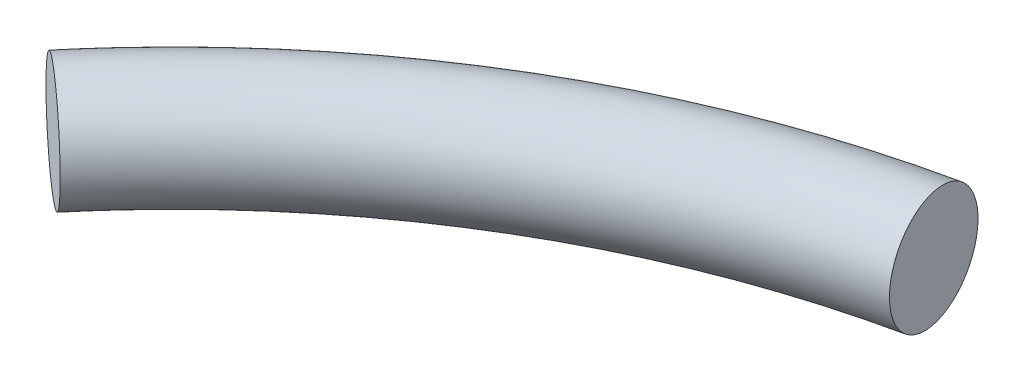
ISO-10303-21;
HEADER;
FILE_DESCRIPTION(('STEP AP214'),'2;1');
FILE_NAME('part.step','',(''),(''),'','','');
FILE_SCHEMA(('AUTOMOTIVE_DESIGN { 1 0 10303 214 1 1 1 1 }'));
ENDSEC;
DATA;
#1=APPLICATION_CONTEXT('core data for automotive mechanical design processes');
#2=APPLICATION_PROTOCOL_DEFINITION('international standard','automotive_design',2000,#1);
#3=PRODUCT_CONTEXT('',#1,'mechanical');
#4=PRODUCT('Part','Part','',(#3));
#5=PRODUCT_RELATED_PRODUCT_CATEGORY('part','',(#4));
#6=PRODUCT_DEFINITION_FORMATION('','',#4);
#7=PRODUCT_DEFINITION_CONTEXT('part definition',#1,'design');
#8=PRODUCT_DEFINITION('design','',#6,#7);
#9=PRODUCT_DEFINITION_SHAPE('','',#8);
#10=(LENGTH_UNIT() NAMED_UNIT(*) SI_UNIT(.MILLI.,.METRE.));
#11=(NAMED_UNIT(*) PLANE_ANGLE_UNIT() SI_UNIT($,.RADIAN.));
#12=(NAMED_UNIT(*) SI_UNIT($,.STERADIAN.) SOLID_ANGLE_UNIT());
#13=UNCERTAINTY_MEASURE_WITH_UNIT(LENGTH_MEASURE(1.E-05),#10,'distance_accuracy_value','');
#14=(GEOMETRIC_REPRESENTATION_CONTEXT(3) GLOBAL_UNCERTAINTY_ASSIGNED_CONTEXT((#13)) GLOBAL_UNIT_ASSIGNED_CONTEXT((#10,
#11,#12)) REPRESENTATION_CONTEXT('',''));
#15=CARTESIAN_POINT('',(0.,0.,0.));
#16=DIRECTION('',(0.,0.,1.));
#17=DIRECTION('',(1.,0.,0.));
#18=AXIS2_PLACEMENT_3D('',#15,#16,#17);
#19=CARTESIAN_POINT('',(0.,0.,0.));
#20=DIRECTION('',(-0.978147600733797,0.,0.207911690817799));
#21=DIRECTION('',(0.207911690817799,0.,0.978147600733797));
#22=AXIS2_PLACEMENT_3D('',#19,#20,#21);
#23=PLANE('',#22);
#24=CARTESIAN_POINT('',(-1.50989125384964,5.2698,-7.10347985489777));
#25=CARTESIAN_POINT('',(-1.50989087011155,5.24734475844036,-7.10347804955197));
#26=CARTESIAN_POINT('',(-1.50949666913671,5.22486914274062,-7.10162347977657));
#27=CARTESIAN_POINT('',(-1.50792840970871,5.1805175487025,-7.09424539925213));
#28=CARTESIAN_POINT('',(-1.50675268218475,5.158642958289,-7.08871403614237));
#29=CARTESIAN_POINT('',(-1.5036563970018,5.11619038165277,-7.07414715964313));
#30=CARTESIAN_POINT('',(-1.50173716873372,5.09561015699665,-7.06511790054617));
#31=CARTESIAN_POINT('',(-1.49720480253545,5.05626266277758,-7.04379479406258));
#32=CARTESIAN_POINT('',(-1.49459068021676,5.03749801701042,-7.03149631549222));
#33=CARTESIAN_POINT('',(-1.48874829778631,5.00237251506183,-7.00401006719887));
#34=CARTESIAN_POINT('',(-1.4855209088445,4.98600830669737,-6.98882639600825));
#35=CARTESIAN_POINT('',(-1.47853615378673,4.9560951150933,-6.95596570705613));
#36=CARTESIAN_POINT('',(-1.47477805207972,4.94255010496093,-6.93828522861083));
#37=CARTESIAN_POINT('',(-1.46684505223587,4.91869805812555,-6.90096339868698));
#38=CARTESIAN_POINT('',(-1.46267045967033,4.9083886701999,-6.88132348480836));
#39=CARTESIAN_POINT('',(-1.45402041998998,4.89128651697562,-6.84062824768));
#40=CARTESIAN_POINT('',(-1.44954495519316,4.88449395856254,-6.81957284124297));
#41=CARTESIAN_POINT('',(-1.44042058428252,4.87461938707083,-6.77664605112673));
#42=CARTESIAN_POINT('',(-1.43577168327323,4.87153726487626,-6.75477469146245));
#43=CARTESIAN_POINT('',(-1.42643228285054,4.8691706838228,-6.7108362670294));
#44=CARTESIAN_POINT('',(-1.42174178343714,4.86988622496393,-6.68876920226063));
#45=CARTESIAN_POINT('',(-1.41245219710747,4.87509474506563,-6.64506513470946));
#46=CARTESIAN_POINT('',(-1.40785311288364,4.87958783511791,-6.62342814459403));
#47=CARTESIAN_POINT('',(-1.39887733290804,4.89222364907398,-6.58120041986478));
#48=CARTESIAN_POINT('',(-1.39450062409193,4.90036615830119,-6.56060962378806));
#49=CARTESIAN_POINT('',(-1.38609045138739,4.92007688548478,-6.52104287205636));
#50=CARTESIAN_POINT('',(-1.38205724001212,4.93164759608104,-6.50206810438239));
#51=CARTESIAN_POINT('',(-1.37445764650861,4.95786514969766,-6.46631482796599));
#52=CARTESIAN_POINT('',(-1.37089061966088,4.97250766984349,-6.44953328605683));
#53=CARTESIAN_POINT('',(-1.3643132027818,5.00448602525169,-6.41858897256494));
#54=CARTESIAN_POINT('',(-1.36130360586346,5.02182563442235,-6.40442993228553));
#55=CARTESIAN_POINT('',(-1.35593671636524,5.05866468164223,-6.37918070235798));
#56=CARTESIAN_POINT('',(-1.35357850216772,5.07816101291839,-6.36808617683968));
#57=CARTESIAN_POINT('',(-1.349571907778,5.11881373737466,-6.34923663223735));
#58=CARTESIAN_POINT('',(-1.34792480071488,5.1399730284603,-6.3414876027547));
#59=CARTESIAN_POINT('',(-1.34539628575177,5.18328650996402,-6.32959187512699));
#60=CARTESIAN_POINT('',(-1.34451324834242,5.20543847660513,-6.32543751074315));
#61=CARTESIAN_POINT('',(-1.34371535132199,5.241730237853,-6.32168370039655));
#62=CARTESIAN_POINT('',(-1.34356166128498,5.25576113714254,-6.32096064562093));
#63=CARTESIAN_POINT('',(-1.3435622849335,5.29225524155964,-6.32096357965653));
#64=CARTESIAN_POINT('',(-1.34395648590833,5.31473085725938,-6.32281814943193));
#65=CARTESIAN_POINT('',(-1.34552474533633,5.35908245129751,-6.33019622995637));
#66=CARTESIAN_POINT('',(-1.3467004728603,5.380957041711,-6.33572759306613));
#67=CARTESIAN_POINT('',(-1.34979675804324,5.42340961834723,-6.35029446956537));
#68=CARTESIAN_POINT('',(-1.35171598631132,5.44398984300335,-6.35932372866233));
#69=CARTESIAN_POINT('',(-1.3562483525096,5.48333733722242,-6.38064683514592));
#70=CARTESIAN_POINT('',(-1.35886247482829,5.50210198298958,-6.39294531371628));
#71=CARTESIAN_POINT('',(-1.36470485725873,5.53722748493817,-6.42043156200963));
#72=CARTESIAN_POINT('',(-1.36793224620054,5.55359169330263,-6.43561523320025));
#73=CARTESIAN_POINT('',(-1.37491700125831,5.5835048849067,-6.46847592215237));
#74=CARTESIAN_POINT('',(-1.37867510296533,5.59704989503907,-6.48615640059767));
#75=CARTESIAN_POINT('',(-1.38660810280918,5.62090194187445,-6.52347823052152));
#76=CARTESIAN_POINT('',(-1.39078269537471,5.6312113298001,-6.54311814440014));
#77=CARTESIAN_POINT('',(-1.39943273505506,5.64831348302438,-6.5838133815285));
#78=CARTESIAN_POINT('',(-1.40390819985188,5.65510604143746,-6.60486878796552));
#79=CARTESIAN_POINT('',(-1.41303257076252,5.66498061292917,-6.64779557808177));
#80=CARTESIAN_POINT('',(-1.41768147177181,5.66806273512374,-6.66966693774605));
#81=CARTESIAN_POINT('',(-1.4270208721945,5.6704293161772,-6.7136053621791));
#82=CARTESIAN_POINT('',(-1.4317113716079,5.66971377503608,-6.73567242694787));
#83=CARTESIAN_POINT('',(-1.44100095793758,5.66450525493437,-6.77937649449904));
#84=CARTESIAN_POINT('',(-1.4456000421614,5.66001216488209,-6.80101348461448));
#85=CARTESIAN_POINT('',(-1.454575822137,5.64737635092602,-6.84324120934372));
#86=CARTESIAN_POINT('',(-1.45895253095312,5.63923384169881,-6.86383200542044));
#87=CARTESIAN_POINT('',(-1.46736270365766,5.61952311451522,-6.90339875715214));
#88=CARTESIAN_POINT('',(-1.47139591503293,5.60795240391896,-6.92237352482611));
#89=CARTESIAN_POINT('',(-1.47899550853644,5.58173485030234,-6.95812680124251));
#90=CARTESIAN_POINT('',(-1.48256253538417,5.56709233015651,-6.97490834315167));
#91=CARTESIAN_POINT('',(-1.48913995226325,5.53511397474831,-7.00585265664356));
#92=CARTESIAN_POINT('',(-1.49214954918158,5.51777436557765,-7.02001169692297));
#93=CARTESIAN_POINT('',(-1.4975164386798,5.48093531835777,-7.04526092685052));
#94=CARTESIAN_POINT('',(-1.49987465287733,5.46143898708161,-7.05635545236882));
#95=CARTESIAN_POINT('',(-1.50388124726705,5.42078626262534,-7.07520499697115));
#96=CARTESIAN_POINT('',(-1.50552835433016,5.3996269715397,-7.0829540264538));
#97=CARTESIAN_POINT('',(-1.50805686929327,5.35631349003598,-7.09484975408151));
#98=CARTESIAN_POINT('',(-1.50893990670263,5.33416152339487,-7.09900411846535));
#99=CARTESIAN_POINT('',(-1.50973780372306,5.29786976214701,-7.10275792881195));
#100=CARTESIAN_POINT('',(-1.50989149376007,5.28383886285746,-7.10348098358757));
#101=CARTESIAN_POINT('',(-1.50989125384964,5.2698,-7.10347985489777));
#102=B_SPLINE_CURVE_WITH_KNOTS('',3,(#24,#25,#26,#27,#28,#29,#30,#31,#32,#33,#34,#35,#36,#37,
#38,#39,#40,#41,#42,#43,#44,#45,#46,#47,#48,#49,#50,#51,#52,#53,#54,#55,#56,#57,#58,#59,#60,#61,
#62,#63,#64,#65,#66,#67,#68,#69,#70,#71,#72,#73,#74,#75,#76,#77,#78,#79,#80,#81,#82,#83,#84,#85,
#86,#87,#88,#89,#90,#91,#92,#93,#94,#95,#96,#97,#98,#99,#100,#101),.UNSPECIFIED.,.T.,.F.,(4,2,2,
2,2,2,2,2,2,2,2,2,2,2,2,2,2,2,2,2,2,2,2,2,2,2,2,2,2,2,2,2,2,2,2,2,2,2,4),(0.,0.067321719094076,
0.134787678055462,0.2021335594909,0.269575356418625,0.336922056232695,0.40436303479347,
0.471754892083668,0.539150713403567,0.606544552708821,0.673938392014077,0.741334213333976,
0.808726070624175,0.876167049184948,0.943513748999018,1.01095554592846,1.07830142736561,
1.14576738632871,1.2130891054245,1.25517818200736,1.32249990110144,1.38996586006282,
1.45731174149826,1.52475353842599,1.59210023824006,1.65954121680083,1.72693307409103,
1.79432889541093,1.86172273471618,1.92911657402144,1.99651239534134,2.06390425263154,
2.13134523119231,2.19869193100638,2.26613372793582,2.33347960937297,2.40094556833608,
2.46826728743186,2.51035636401472),.UNSPECIFIED.);
#103=CARTESIAN_POINT('',(-1.50989125384964,5.2698,-7.10347985489777));
#104=VERTEX_POINT('',#103);
#105=EDGE_CURVE('E18',#104,#104,#102,.T.);
#106=ORIENTED_EDGE('',*,*,#105,.F.);
#107=EDGE_LOOP('',(#106));
#108=FACE_BOUND('',#107,.T.);
#109=ADVANCED_FACE('F14',(#108),#23,.F.);
#110=CARTESIAN_POINT('',(0.,0.,0.));
#111=DIRECTION('',(-0.642787609686505,0.,0.766044443119007));
#112=DIRECTION('',(0.766044443119007,0.,0.642787609686505));
#113=AXIS2_PLACEMENT_3D('',#110,#111,#112);
#114=PLANE('',#113);
#115=CARTESIAN_POINT('',(-4.95031387772752,5.2698,-4.15380654901256));
#116=CARTESIAN_POINT('',(-4.95031529159912,5.24734475844036,-4.1538077353917));
#117=CARTESIAN_POINT('',(-4.95176771337039,5.22486914274062,-4.15502646196428));
#118=CARTESIAN_POINT('',(-4.95754591860485,5.1805175487025,-4.15987495184539));
#119=CARTESIAN_POINT('',(-4.96187785170976,5.158642958289,-4.163509875316));
#120=CARTESIAN_POINT('',(-4.97328602240656,5.11619038165277,-4.17308246714009));
#121=CARTESIAN_POINT('',(-4.98035736189717,5.09561015699665,-4.17901602549859));
#122=CARTESIAN_POINT('',(-4.9970567303969,5.05626266277758,-4.19302845944761));
#123=CARTESIAN_POINT('',(-5.00668838635617,5.03749801701042,-4.20111037841065));
#124=CARTESIAN_POINT('',(-5.02821447071349,5.00237251506183,-4.21917290785557));
#125=CARTESIAN_POINT('',(-5.04010568931179,4.98600830669737,-4.22915082499565));
#126=CARTESIAN_POINT('',(-5.06584081164909,4.9560951150933,-4.25074515665718));
#127=CARTESIAN_POINT('',(-5.07968742565147,4.94255010496093,-4.26236384535963));
#128=CARTESIAN_POINT('',(-5.10891632770955,4.91869805812555,-4.28688980629629));
#129=CARTESIAN_POINT('',(-5.1242974898969,4.9083886701999,-4.29979613381476));
#130=CARTESIAN_POINT('',(-5.15616830391332,4.89128651697562,-4.32653892210126));
#131=CARTESIAN_POINT('',(-5.1726580208912,4.88449395856254,-4.34037543753561));
#132=CARTESIAN_POINT('',(-5.20627649422264,4.87461938707083,-4.36858468610877));
#133=CARTESIAN_POINT('',(-5.2234052317687,4.87153726487626,-4.3829574034662));
#134=CARTESIAN_POINT('',(-5.25781597494396,4.8691706838228,-4.41183144537309));
#135=CARTESIAN_POINT('',(-5.27509798057315,4.86988622496392,-4.42633276992255));
#136=CARTESIAN_POINT('',(-5.30932518520378,4.87509474506563,-4.45505280470434));
#137=CARTESIAN_POINT('',(-5.32627037428497,4.87958783511791,-4.46927150661259));
#138=CARTESIAN_POINT('',(-5.35934136873421,4.89222364907398,-4.49702136585761));
#139=CARTESIAN_POINT('',(-5.37546722223744,4.90036615830119,-4.51055256358459));
#140=CARTESIAN_POINT('',(-5.40645425351329,4.92007688548478,-4.53655377009943));
#141=CARTESIAN_POINT('',(-5.42131450090869,4.93164759608104,-4.54902299820811));
#142=CARTESIAN_POINT('',(-5.44931497721874,4.95786514969766,-4.57251818755266));
#143=CARTESIAN_POINT('',(-5.46245758158318,4.97250766984349,-4.58354614202757));
#144=CARTESIAN_POINT('',(-5.48669187851221,5.00448602525169,-4.60388113164256));
#145=CARTESIAN_POINT('',(-5.4977806488755,5.02182563442235,-4.6131857147646));
#146=CARTESIAN_POINT('',(-5.51755479366154,5.05866468164223,-4.62977819236142));
#147=CARTESIAN_POINT('',(-5.52624356375714,5.07816101291839,-4.63706893614402));
#148=CARTESIAN_POINT('',(-5.54100574166067,5.11881373737466,-4.64945587417824));
#149=CARTESIAN_POINT('',(-5.54707445866237,5.1399730284603,-4.65454813237609));
#150=CARTESIAN_POINT('',(-5.55639069686531,5.18328650996402,-4.66236538441613));
#151=CARTESIAN_POINT('',(-5.55964422194531,5.20543847660513,-4.66509541611079));
#152=CARTESIAN_POINT('',(-5.56258404979376,5.241730237853,-4.66756222457415));
#153=CARTESIAN_POINT('',(-5.56315031616554,5.25576113714254,-4.66803737847786));
#154=CARTESIAN_POINT('',(-5.56314801835112,5.29225524155964,-4.66803545038262));
#155=CARTESIAN_POINT('',(-5.56169559657985,5.31473085725938,-4.66681672381004));
#156=CARTESIAN_POINT('',(-5.55591739134539,5.35908245129751,-4.66196823392893));
#157=CARTESIAN_POINT('',(-5.55158545824048,5.380957041711,-4.65833331045832));
#158=CARTESIAN_POINT('',(-5.54017728754368,5.42340961834723,-4.64876071863423));
#159=CARTESIAN_POINT('',(-5.53310594805307,5.44398984300335,-4.64282716027573));
#160=CARTESIAN_POINT('',(-5.51640657955334,5.48333733722242,-4.62881472632671));
#161=CARTESIAN_POINT('',(-5.50677492359407,5.50210198298958,-4.62073280736367));
#162=CARTESIAN_POINT('',(-5.48524883923675,5.53722748493817,-4.60267027791875));
#163=CARTESIAN_POINT('',(-5.47335762063846,5.55359169330263,-4.59269236077867));
#164=CARTESIAN_POINT('',(-5.44762249830115,5.5835048849067,-4.57109802911713));
#165=CARTESIAN_POINT('',(-5.43377588429877,5.59704989503907,-4.55947934041469));
#166=CARTESIAN_POINT('',(-5.40454698224069,5.62090194187445,-4.53495337947803));
#167=CARTESIAN_POINT('',(-5.38916582005334,5.6312113298001,-4.52204705195956));
#168=CARTESIAN_POINT('',(-5.35729500603692,5.64831348302438,-4.49530426367306));
#169=CARTESIAN_POINT('',(-5.34080528905904,5.65510604143746,-4.48146774823871));
#170=CARTESIAN_POINT('',(-5.3071868157276,5.66498061292917,-4.45325849966555));
#171=CARTESIAN_POINT('',(-5.29005807818154,5.66806273512374,-4.43888578230812));
#172=CARTESIAN_POINT('',(-5.25564733500628,5.6704293161772,-4.41001174040123));
#173=CARTESIAN_POINT('',(-5.23836532937709,5.66971377503608,-4.39551041585177));
#174=CARTESIAN_POINT('',(-5.20413812474646,5.66450525493437,-4.36679038106998));
#175=CARTESIAN_POINT('',(-5.18719293566527,5.66001216488209,-4.35257167916173));
#176=CARTESIAN_POINT('',(-5.15412194121603,5.64737635092602,-4.32482181991671));
#177=CARTESIAN_POINT('',(-5.13799608771281,5.63923384169881,-4.31129062218974));
#178=CARTESIAN_POINT('',(-5.10700905643695,5.61952311451522,-4.28528941567489));
#179=CARTESIAN_POINT('',(-5.09214880904155,5.60795240391896,-4.27282018756621));
#180=CARTESIAN_POINT('',(-5.0641483327315,5.58173485030234,-4.24932499822166));
#181=CARTESIAN_POINT('',(-5.05100572836706,5.56709233015651,-4.23829704374675));
#182=CARTESIAN_POINT('',(-5.02677143143803,5.53511397474831,-4.21796205413176));
#183=CARTESIAN_POINT('',(-5.01568266107474,5.51777436557765,-4.20865747100972));
#184=CARTESIAN_POINT('',(-4.9959085162887,5.48093531835777,-4.1920649934129));
#185=CARTESIAN_POINT('',(-4.9872197461931,5.46143898708161,-4.1847742496303));
#186=CARTESIAN_POINT('',(-4.97245756828957,5.42078626262534,-4.17238731159608));
#187=CARTESIAN_POINT('',(-4.96638885128787,5.3996269715397,-4.16729505339823));
#188=CARTESIAN_POINT('',(-4.95707261308493,5.35631349003598,-4.15947780135819));
#189=CARTESIAN_POINT('',(-4.95381908800493,5.33416152339487,-4.15674776966353));
#190=CARTESIAN_POINT('',(-4.95087926015648,5.297869762147,-4.15428096120017));
#191=CARTESIAN_POINT('',(-4.9503129937847,5.28383886285746,-4.15380580729646));
#192=CARTESIAN_POINT('',(-4.95031387772752,5.2698,-4.15380654901256));
#193=B_SPLINE_CURVE_WITH_KNOTS('',3,(#115,#116,#117,#118,#119,#120,#121,#122,#123,#124,#125,
#126,#127,#128,#129,#130,#131,#132,#133,#134,#135,#136,#137,#138,#139,#140,#141,#142,#143,#144,
#145,#146,#147,#148,#149,#150,#151,#152,#153,#154,#155,#156,#157,#158,#159,#160,#161,#162,#163,
#164,#165,#166,#167,#168,#169,#170,#171,#172,#173,#174,#175,#176,#177,#178,#179,#180,#181,#182,
#183,#184,#185,#186,#187,#188,#189,#190,#191,#192),.UNSPECIFIED.,.T.,.F.,(4,2,2,2,2,2,2,2,2,2,2,
2,2,2,2,2,2,2,2,2,2,2,2,2,2,2,2,2,2,2,2,2,2,2,2,2,2,2,4),(0.,0.0673217190940751,
0.134787678055461,0.202133559490899,0.269575356418626,0.336922056232695,0.404363034793469,
0.471754892083667,0.539150713403565,0.606544552708821,0.673938392014079,0.741334213333977,
0.808726070624175,0.876167049184948,0.943513748999018,1.01095554592846,1.07830142736561,
1.14576738632871,1.2130891054245,1.25517818200736,1.32249990110144,1.38996586006282,
1.45731174149826,1.52475353842599,1.59210023824006,1.65954121680083,1.72693307409103,
1.79432889541093,1.86172273471618,1.92911657402144,1.99651239534134,2.06390425263154,
2.13134523119231,2.19869193100638,2.26613372793582,2.33347960937297,2.40094556833608,
2.46826728743186,2.51035636401472),.UNSPECIFIED.);
#194=CARTESIAN_POINT('',(-4.95031387772752,5.2698,-4.15380654901256));
#195=VERTEX_POINT('',#194);
#196=EDGE_CURVE('E10',#195,#195,#193,.T.);
#197=ORIENTED_EDGE('',*,*,#196,.F.);
#198=EDGE_LOOP('',(#197));
#199=FACE_BOUND('',#198,.T.);
#200=ADVANCED_FACE('F36',(#199),#114,.T.);
#201=CARTESIAN_POINT('',(0.,5.2698,0.));
#202=DIRECTION('',(0.,1.,0.));
#203=DIRECTION('',(-0.642787609686505,0.,0.766044443119007));
#204=AXIS2_PLACEMENT_3D('',#201,#202,#203);
#205=TOROIDAL_SURFACE('',#204,6.862175820468,0.4);
#206=ORIENTED_EDGE('',*,*,#196,.T.);
#207=EDGE_LOOP('',(#206));
#208=FACE_BOUND('',#207,.T.);
#209=ORIENTED_EDGE('',*,*,#105,.T.);
#210=EDGE_LOOP('',(#209));
#211=FACE_BOUND('',#210,.T.);
#212=ADVANCED_FACE('F34',(#208,#211),#205,.T.);
#213=CLOSED_SHELL('',(#109,#200,#212));
#214=MANIFOLD_SOLID_BREP('B1',#213);
#215=ADVANCED_BREP_SHAPE_REPRESENTATION('',(#18,#214),#14);
#216=SHAPE_DEFINITION_REPRESENTATION(#9,#215);
ENDSEC;
END-ISO-10303-21;
